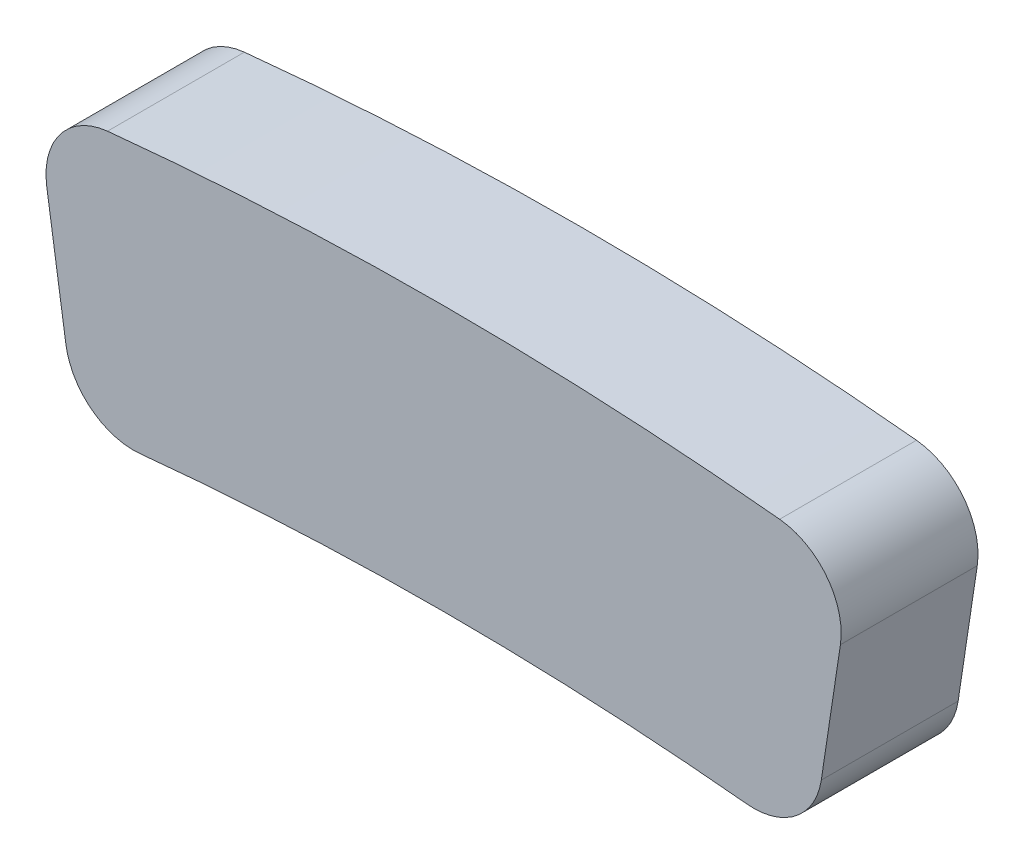
ISO-10303-21;
HEADER;
FILE_DESCRIPTION(('STEP AP214'),'2;1');
FILE_NAME('part.step','',(''),(''),'','','');
FILE_SCHEMA(('AUTOMOTIVE_DESIGN { 1 0 10303 214 1 1 1 1 }'));
ENDSEC;
DATA;
#1=APPLICATION_CONTEXT('core data for automotive mechanical design processes');
#2=APPLICATION_PROTOCOL_DEFINITION('international standard','automotive_design',2000,#1);
#3=PRODUCT_CONTEXT('',#1,'mechanical');
#4=PRODUCT('Part','Part','',(#3));
#5=PRODUCT_RELATED_PRODUCT_CATEGORY('part','',(#4));
#6=PRODUCT_DEFINITION_FORMATION('','',#4);
#7=PRODUCT_DEFINITION_CONTEXT('part definition',#1,'design');
#8=PRODUCT_DEFINITION('design','',#6,#7);
#9=PRODUCT_DEFINITION_SHAPE('','',#8);
#10=(LENGTH_UNIT() NAMED_UNIT(*) SI_UNIT(.MILLI.,.METRE.));
#11=(NAMED_UNIT(*) PLANE_ANGLE_UNIT() SI_UNIT($,.RADIAN.));
#12=(NAMED_UNIT(*) SI_UNIT($,.STERADIAN.) SOLID_ANGLE_UNIT());
#13=UNCERTAINTY_MEASURE_WITH_UNIT(LENGTH_MEASURE(1.E-05),#10,'distance_accuracy_value','');
#14=(GEOMETRIC_REPRESENTATION_CONTEXT(3) GLOBAL_UNCERTAINTY_ASSIGNED_CONTEXT((#13)) GLOBAL_UNIT_ASSIGNED_CONTEXT((#10,
#11,#12)) REPRESENTATION_CONTEXT('',''));
#15=CARTESIAN_POINT('',(0.,0.,0.));
#16=DIRECTION('',(0.,0.,1.));
#17=DIRECTION('',(1.,0.,0.));
#18=AXIS2_PLACEMENT_3D('',#15,#16,#17);
#19=CARTESIAN_POINT('',(0.,0.,4.));
#20=DIRECTION('',(0.,0.,-1.));
#21=DIRECTION('',(-1.,0.,0.));
#22=AXIS2_PLACEMENT_3D('',#19,#20,#21);
#23=CYLINDRICAL_SURFACE('',#22,97.372);
#24=CARTESIAN_POINT('',(0.,0.,4.));
#25=DIRECTION('',(0.,0.,1.));
#26=DIRECTION('',(1.,0.,0.));
#27=AXIS2_PLACEMENT_3D('',#24,#25,#26);
#28=CIRCLE('',#27,97.372);
#29=CARTESIAN_POINT('',(9.82317013732213,96.8752378704343,4.));
#30=VERTEX_POINT('',#29);
#31=CARTESIAN_POINT('',(-9.82317013732212,96.8752378704343,4.));
#32=VERTEX_POINT('',#31);
#33=EDGE_CURVE('E124',#30,#32,#28,.T.);
#34=ORIENTED_EDGE('',*,*,#33,.F.);
#35=DIRECTION('',(0.,0.,-1.));
#36=VECTOR('',#35,1.);
#37=CARTESIAN_POINT('',(9.82317013732213,96.8752378704343,4.));
#38=LINE('',#37,#36);
#39=CARTESIAN_POINT('',(9.82317013732213,96.8752378704343,0.));
#40=VERTEX_POINT('',#39);
#41=EDGE_CURVE('E109',#30,#40,#38,.T.);
#42=ORIENTED_EDGE('',*,*,#41,.T.);
#43=CARTESIAN_POINT('',(0.,0.,0.));
#44=DIRECTION('',(0.,0.,1.));
#45=DIRECTION('',(1.,0.,0.));
#46=AXIS2_PLACEMENT_3D('',#43,#44,#45);
#47=CIRCLE('',#46,97.372);
#48=CARTESIAN_POINT('',(-9.82317013732212,96.8752378704343,0.));
#49=VERTEX_POINT('',#48);
#50=EDGE_CURVE('E121',#40,#49,#47,.T.);
#51=ORIENTED_EDGE('',*,*,#50,.T.);
#52=DIRECTION('',(0.,0.,-1.));
#53=VECTOR('',#52,1.);
#54=CARTESIAN_POINT('',(-9.82317013732212,96.8752378704343,4.));
#55=LINE('',#54,#53);
#56=EDGE_CURVE('E126',#49,#32,#55,.F.);
#57=ORIENTED_EDGE('',*,*,#56,.T.);
#58=EDGE_LOOP('',(#34,#42,#51,#57));
#59=FACE_BOUND('',#58,.T.);
#60=ADVANCED_FACE('F39',(#59),#23,.T.);
#61=CARTESIAN_POINT('',(-11.9086095461443,96.6410440893386,4.));
#62=DIRECTION('',(0.988830826225129,0.149042266176173,0.));
#63=DIRECTION('',(-0.149042266176173,0.988830826225129,0.));
#64=AXIS2_PLACEMENT_3D('',#61,#62,#63);
#65=PLANE('',#64);
#66=DIRECTION('',(0.149042266176173,-0.988830826225129,0.));
#67=VECTOR('',#66,1.);
#68=CARTESIAN_POINT('',(-11.9086095461443,96.6410440893386,0.));
#69=LINE('',#68,#67);
#70=CARTESIAN_POINT('',(-11.5990659815868,94.5873567256999,0.));
#71=VERTEX_POINT('',#70);
#72=CARTESIAN_POINT('',(-11.0403666392573,90.8806287856261,0.));
#73=VERTEX_POINT('',#72);
#74=EDGE_CURVE('E130',#71,#73,#69,.T.);
#75=ORIENTED_EDGE('',*,*,#74,.T.);
#76=DIRECTION('',(0.,0.,-1.));
#77=VECTOR('',#76,1.);
#78=CARTESIAN_POINT('',(-11.0403666392573,90.8806287856261,4.));
#79=LINE('',#78,#77);
#80=CARTESIAN_POINT('',(-11.0403666392573,90.8806287856261,4.));
#81=VERTEX_POINT('',#80);
#82=EDGE_CURVE('E11',#73,#81,#79,.F.);
#83=ORIENTED_EDGE('',*,*,#82,.T.);
#84=DIRECTION('',(0.149042266176173,-0.988830826225129,0.));
#85=VECTOR('',#84,1.);
#86=CARTESIAN_POINT('',(-11.9086095461443,96.6410440893386,4.));
#87=LINE('',#86,#85);
#88=CARTESIAN_POINT('',(-11.5990659815868,94.5873567256999,4.));
#89=VERTEX_POINT('',#88);
#90=EDGE_CURVE('E166',#89,#81,#87,.T.);
#91=ORIENTED_EDGE('',*,*,#90,.F.);
#92=DIRECTION('',(0.,0.,-1.));
#93=VECTOR('',#92,1.);
#94=CARTESIAN_POINT('',(-11.5990659815868,94.5873567256999,4.));
#95=LINE('',#94,#93);
#96=EDGE_CURVE('E47',#89,#71,#95,.T.);
#97=ORIENTED_EDGE('',*,*,#96,.T.);
#98=EDGE_LOOP('',(#75,#83,#91,#97));
#99=FACE_BOUND('',#98,.T.);
#100=ADVANCED_FACE('F164',(#99),#65,.F.);
#101=CARTESIAN_POINT('',(0.,0.,4.));
#102=DIRECTION('',(0.,0.,-1.));
#103=DIRECTION('',(-1.,0.,0.));
#104=AXIS2_PLACEMENT_3D('',#101,#102,#103);
#105=CYLINDRICAL_SURFACE('',#104,89.628);
#106=CARTESIAN_POINT('',(0.,0.,0.));
#107=DIRECTION('',(0.,0.,-1.));
#108=DIRECTION('',(1.,0.,0.));
#109=AXIS2_PLACEMENT_3D('',#106,#107,#108);
#110=CIRCLE('',#109,89.628);
#111=CARTESIAN_POINT('',(-8.86488979959775,89.1885200731629,0.));
#112=VERTEX_POINT('',#111);
#113=CARTESIAN_POINT('',(8.86488979959775,89.1885200731629,0.));
#114=VERTEX_POINT('',#113);
#115=EDGE_CURVE('E133',#112,#114,#110,.T.);
#116=ORIENTED_EDGE('',*,*,#115,.T.);
#117=DIRECTION('',(0.,0.,-1.));
#118=VECTOR('',#117,1.);
#119=CARTESIAN_POINT('',(8.86488979959775,89.1885200731629,4.));
#120=LINE('',#119,#118);
#121=CARTESIAN_POINT('',(8.86488979959775,89.1885200731629,4.));
#122=VERTEX_POINT('',#121);
#123=EDGE_CURVE('E54',#114,#122,#120,.F.);
#124=ORIENTED_EDGE('',*,*,#123,.T.);
#125=CARTESIAN_POINT('',(0.,0.,4.));
#126=DIRECTION('',(0.,0.,-1.));
#127=DIRECTION('',(1.,0.,0.));
#128=AXIS2_PLACEMENT_3D('',#125,#126,#127);
#129=CIRCLE('',#128,89.628);
#130=CARTESIAN_POINT('',(-8.86488979959775,89.1885200731629,4.));
#131=VERTEX_POINT('',#130);
#132=EDGE_CURVE('E174',#131,#122,#129,.T.);
#133=ORIENTED_EDGE('',*,*,#132,.F.);
#134=DIRECTION('',(0.,0.,-1.));
#135=VECTOR('',#134,1.);
#136=CARTESIAN_POINT('',(-8.86488979959775,89.1885200731629,4.));
#137=LINE('',#136,#135);
#138=EDGE_CURVE('E157',#131,#112,#137,.T.);
#139=ORIENTED_EDGE('',*,*,#138,.T.);
#140=EDGE_LOOP('',(#116,#124,#133,#139));
#141=FACE_BOUND('',#140,.T.);
#142=ADVANCED_FACE('F173',(#141),#105,.F.);
#143=CARTESIAN_POINT('',(10.7539692790008,88.9805064536402,4.));
#144=DIRECTION('',(-0.988830826225129,0.149042266176172,0.));
#145=DIRECTION('',(-0.149042266176172,-0.988830826225129,0.));
#146=AXIS2_PLACEMENT_3D('',#143,#144,#145);
#147=PLANE('',#146);
#148=DIRECTION('',(0.149042266176172,0.988830826225129,0.));
#149=VECTOR('',#148,1.);
#150=CARTESIAN_POINT('',(10.7539692790008,88.9805064536402,0.));
#151=LINE('',#150,#149);
#152=CARTESIAN_POINT('',(11.0403666392573,90.8806287856261,0.));
#153=VERTEX_POINT('',#152);
#154=CARTESIAN_POINT('',(11.5990659815868,94.5873567256999,0.));
#155=VERTEX_POINT('',#154);
#156=EDGE_CURVE('E140',#153,#155,#151,.T.);
#157=ORIENTED_EDGE('',*,*,#156,.T.);
#158=DIRECTION('',(0.,0.,-1.));
#159=VECTOR('',#158,1.);
#160=CARTESIAN_POINT('',(11.5990659815868,94.5873567256999,4.));
#161=LINE('',#160,#159);
#162=CARTESIAN_POINT('',(11.5990659815868,94.5873567256999,4.));
#163=VERTEX_POINT('',#162);
#164=EDGE_CURVE('E110',#155,#163,#161,.F.);
#165=ORIENTED_EDGE('',*,*,#164,.T.);
#166=DIRECTION('',(0.149042266176172,0.988830826225129,0.));
#167=VECTOR('',#166,1.);
#168=CARTESIAN_POINT('',(10.7539692790008,88.9805064536402,4.));
#169=LINE('',#168,#167);
#170=CARTESIAN_POINT('',(11.0403666392573,90.8806287856261,4.));
#171=VERTEX_POINT('',#170);
#172=EDGE_CURVE('E136',#171,#163,#169,.T.);
#173=ORIENTED_EDGE('',*,*,#172,.F.);
#174=DIRECTION('',(0.,0.,-1.));
#175=VECTOR('',#174,1.);
#176=CARTESIAN_POINT('',(11.0403666392573,90.8806287856261,4.));
#177=LINE('',#176,#175);
#178=EDGE_CURVE('E115',#171,#153,#177,.T.);
#179=ORIENTED_EDGE('',*,*,#178,.T.);
#180=EDGE_LOOP('',(#157,#165,#173,#179));
#181=FACE_BOUND('',#180,.T.);
#182=ADVANCED_FACE('F202',(#181),#147,.F.);
#183=CARTESIAN_POINT('',(0.,0.,4.));
#184=DIRECTION('',(0.,0.,1.));
#185=DIRECTION('',(1.,0.,0.));
#186=AXIS2_PLACEMENT_3D('',#183,#184,#185);
#187=PLANE('',#186);
#188=ORIENTED_EDGE('',*,*,#172,.T.);
#189=CARTESIAN_POINT('',(9.62140432913657,94.8854412580522,4.));
#190=DIRECTION('',(0.,0.,1.));
#191=DIRECTION('',(1.,0.,0.));
#192=AXIS2_PLACEMENT_3D('',#189,#190,#191);
#193=CIRCLE('',#192,2.);
#194=EDGE_CURVE('E155',#163,#30,#193,.T.);
#195=ORIENTED_EDGE('',*,*,#194,.T.);
#196=ORIENTED_EDGE('',*,*,#33,.T.);
#197=CARTESIAN_POINT('',(-9.62140432913657,94.8854412580522,4.));
#198=DIRECTION('',(0.,0.,1.));
#199=DIRECTION('',(1.,0.,0.));
#200=AXIS2_PLACEMENT_3D('',#197,#198,#199);
#201=CIRCLE('',#200,2.);
#202=EDGE_CURVE('E150',#32,#89,#201,.T.);
#203=ORIENTED_EDGE('',*,*,#202,.T.);
#204=ORIENTED_EDGE('',*,*,#90,.T.);
#205=CARTESIAN_POINT('',(-9.06270498680705,91.1787133179785,4.));
#206=DIRECTION('',(0.,0.,1.));
#207=DIRECTION('',(1.,0.,0.));
#208=AXIS2_PLACEMENT_3D('',#205,#206,#207);
#209=CIRCLE('',#208,2.);
#210=EDGE_CURVE('E61',#81,#131,#209,.T.);
#211=ORIENTED_EDGE('',*,*,#210,.T.);
#212=ORIENTED_EDGE('',*,*,#132,.T.);
#213=CARTESIAN_POINT('',(9.06270498680706,91.1787133179785,4.));
#214=DIRECTION('',(0.,0.,1.));
#215=DIRECTION('',(1.,0.,0.));
#216=AXIS2_PLACEMENT_3D('',#213,#214,#215);
#217=CIRCLE('',#216,2.);
#218=EDGE_CURVE('E153',#122,#171,#217,.T.);
#219=ORIENTED_EDGE('',*,*,#218,.T.);
#220=EDGE_LOOP('',(#188,#195,#196,#203,#204,#211,#212,#219));
#221=FACE_BOUND('',#220,.T.);
#222=ADVANCED_FACE('F179',(#221),#187,.T.);
#223=CARTESIAN_POINT('',(0.,0.,0.));
#224=DIRECTION('',(0.,0.,1.));
#225=DIRECTION('',(1.,0.,0.));
#226=AXIS2_PLACEMENT_3D('',#223,#224,#225);
#227=PLANE('',#226);
#228=ORIENTED_EDGE('',*,*,#50,.F.);
#229=CARTESIAN_POINT('',(9.62140432913657,94.8854412580522,0.));
#230=DIRECTION('',(0.,0.,1.));
#231=DIRECTION('',(1.,0.,0.));
#232=AXIS2_PLACEMENT_3D('',#229,#230,#231);
#233=CIRCLE('',#232,2.);
#234=EDGE_CURVE('E105',#40,#155,#233,.F.);
#235=ORIENTED_EDGE('',*,*,#234,.T.);
#236=ORIENTED_EDGE('',*,*,#156,.F.);
#237=CARTESIAN_POINT('',(9.06270498680706,91.1787133179785,0.));
#238=DIRECTION('',(0.,0.,1.));
#239=DIRECTION('',(1.,0.,0.));
#240=AXIS2_PLACEMENT_3D('',#237,#238,#239);
#241=CIRCLE('',#240,2.);
#242=EDGE_CURVE('E116',#153,#114,#241,.F.);
#243=ORIENTED_EDGE('',*,*,#242,.T.);
#244=ORIENTED_EDGE('',*,*,#115,.F.);
#245=CARTESIAN_POINT('',(-9.06270498680705,91.1787133179785,0.));
#246=DIRECTION('',(0.,0.,1.));
#247=DIRECTION('',(1.,0.,0.));
#248=AXIS2_PLACEMENT_3D('',#245,#246,#247);
#249=CIRCLE('',#248,2.);
#250=EDGE_CURVE('E144',#112,#73,#249,.F.);
#251=ORIENTED_EDGE('',*,*,#250,.T.);
#252=ORIENTED_EDGE('',*,*,#74,.F.);
#253=CARTESIAN_POINT('',(-9.62140432913657,94.8854412580522,0.));
#254=DIRECTION('',(0.,0.,1.));
#255=DIRECTION('',(1.,0.,0.));
#256=AXIS2_PLACEMENT_3D('',#253,#254,#255);
#257=CIRCLE('',#256,2.);
#258=EDGE_CURVE('E125',#71,#49,#257,.F.);
#259=ORIENTED_EDGE('',*,*,#258,.T.);
#260=EDGE_LOOP('',(#228,#235,#236,#243,#244,#251,#252,#259));
#261=FACE_BOUND('',#260,.T.);
#262=ADVANCED_FACE('F128',(#261),#227,.F.);
#263=CARTESIAN_POINT('',(9.62140432913657,94.8854412580522,4.));
#264=DIRECTION('',(0.,0.,-1.));
#265=DIRECTION('',(-1.,0.,0.));
#266=AXIS2_PLACEMENT_3D('',#263,#264,#265);
#267=CYLINDRICAL_SURFACE('',#266,2.);
#268=ORIENTED_EDGE('',*,*,#194,.F.);
#269=ORIENTED_EDGE('',*,*,#164,.F.);
#270=ORIENTED_EDGE('',*,*,#234,.F.);
#271=ORIENTED_EDGE('',*,*,#41,.F.);
#272=EDGE_LOOP('',(#268,#269,#270,#271));
#273=FACE_BOUND('',#272,.T.);
#274=ADVANCED_FACE('F108',(#273),#267,.T.);
#275=CARTESIAN_POINT('',(9.06270498680706,91.1787133179785,4.));
#276=DIRECTION('',(0.,0.,-1.));
#277=DIRECTION('',(-1.,0.,0.));
#278=AXIS2_PLACEMENT_3D('',#275,#276,#277);
#279=CYLINDRICAL_SURFACE('',#278,2.);
#280=ORIENTED_EDGE('',*,*,#218,.F.);
#281=ORIENTED_EDGE('',*,*,#123,.F.);
#282=ORIENTED_EDGE('',*,*,#242,.F.);
#283=ORIENTED_EDGE('',*,*,#178,.F.);
#284=EDGE_LOOP('',(#280,#281,#282,#283));
#285=FACE_BOUND('',#284,.T.);
#286=ADVANCED_FACE('F184',(#285),#279,.T.);
#287=CARTESIAN_POINT('',(-9.06270498680705,91.1787133179785,4.));
#288=DIRECTION('',(0.,0.,-1.));
#289=DIRECTION('',(-1.,0.,0.));
#290=AXIS2_PLACEMENT_3D('',#287,#288,#289);
#291=CYLINDRICAL_SURFACE('',#290,2.);
#292=ORIENTED_EDGE('',*,*,#210,.F.);
#293=ORIENTED_EDGE('',*,*,#82,.F.);
#294=ORIENTED_EDGE('',*,*,#250,.F.);
#295=ORIENTED_EDGE('',*,*,#138,.F.);
#296=EDGE_LOOP('',(#292,#293,#294,#295));
#297=FACE_BOUND('',#296,.T.);
#298=ADVANCED_FACE('F172',(#297),#291,.T.);
#299=CARTESIAN_POINT('',(-9.62140432913657,94.8854412580522,4.));
#300=DIRECTION('',(0.,0.,-1.));
#301=DIRECTION('',(-1.,0.,0.));
#302=AXIS2_PLACEMENT_3D('',#299,#300,#301);
#303=CYLINDRICAL_SURFACE('',#302,2.);
#304=ORIENTED_EDGE('',*,*,#202,.F.);
#305=ORIENTED_EDGE('',*,*,#56,.F.);
#306=ORIENTED_EDGE('',*,*,#258,.F.);
#307=ORIENTED_EDGE('',*,*,#96,.F.);
#308=EDGE_LOOP('',(#304,#305,#306,#307));
#309=FACE_BOUND('',#308,.T.);
#310=ADVANCED_FACE('F41',(#309),#303,.T.);
#311=CLOSED_SHELL('',(#60,#100,#142,#182,#222,#262,#274,#286,#298,#310));
#312=MANIFOLD_SOLID_BREP('B2',#311);
#313=ADVANCED_BREP_SHAPE_REPRESENTATION('',(#18,#312),#14);
#314=SHAPE_DEFINITION_REPRESENTATION(#9,#313);
ENDSEC;
END-ISO-10303-21;
